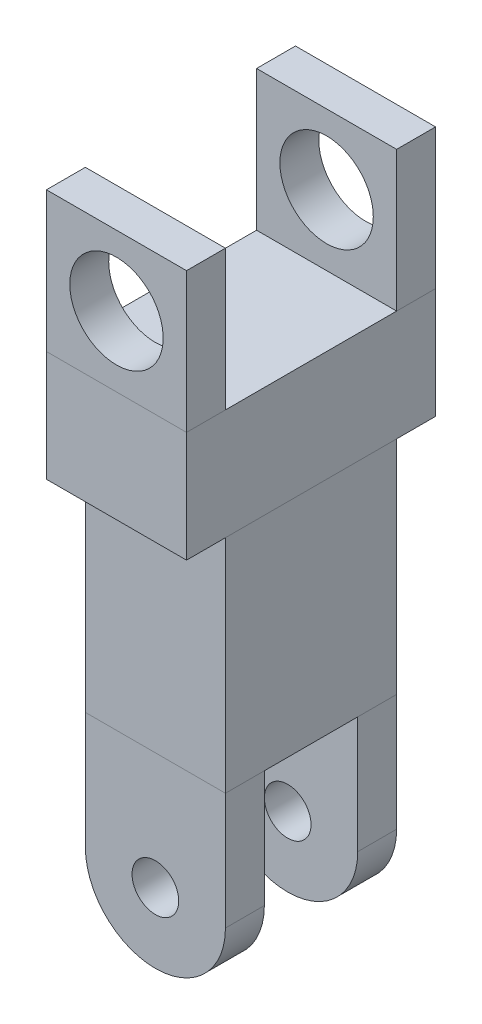
ISO-10303-21;
HEADER;
FILE_DESCRIPTION(('STEP AP214'),'2;1');
FILE_NAME('part.step','',(''),(''),'','','');
FILE_SCHEMA(('AUTOMOTIVE_DESIGN { 1 0 10303 214 1 1 1 1 }'));
ENDSEC;
DATA;
#1=APPLICATION_CONTEXT('core data for automotive mechanical design processes');
#2=APPLICATION_PROTOCOL_DEFINITION('international standard','automotive_design',2000,#1);
#3=PRODUCT_CONTEXT('',#1,'mechanical');
#4=PRODUCT('Part','Part','',(#3));
#5=PRODUCT_RELATED_PRODUCT_CATEGORY('part','',(#4));
#6=PRODUCT_DEFINITION_FORMATION('','',#4);
#7=PRODUCT_DEFINITION_CONTEXT('part definition',#1,'design');
#8=PRODUCT_DEFINITION('design','',#6,#7);
#9=PRODUCT_DEFINITION_SHAPE('','',#8);
#10=(LENGTH_UNIT() NAMED_UNIT(*) SI_UNIT(.MILLI.,.METRE.));
#11=(NAMED_UNIT(*) PLANE_ANGLE_UNIT() SI_UNIT($,.RADIAN.));
#12=(NAMED_UNIT(*) SI_UNIT($,.STERADIAN.) SOLID_ANGLE_UNIT());
#13=UNCERTAINTY_MEASURE_WITH_UNIT(LENGTH_MEASURE(1.E-05),#10,'distance_accuracy_value','');
#14=(GEOMETRIC_REPRESENTATION_CONTEXT(3) GLOBAL_UNCERTAINTY_ASSIGNED_CONTEXT((#13)) GLOBAL_UNIT_ASSIGNED_CONTEXT((#10,
#11,#12)) REPRESENTATION_CONTEXT('',''));
#15=CARTESIAN_POINT('',(0.,0.,0.));
#16=DIRECTION('',(0.,0.,1.));
#17=DIRECTION('',(1.,0.,0.));
#18=AXIS2_PLACEMENT_3D('',#15,#16,#17);
#19=CARTESIAN_POINT('',(4.5,37.83,0.));
#20=DIRECTION('',(-1.,0.,0.));
#21=DIRECTION('',(0.,0.,1.));
#22=AXIS2_PLACEMENT_3D('',#19,#20,#21);
#23=PLANE('',#22);
#24=DIRECTION('',(0.,0.,-1.));
#25=VECTOR('',#24,1.);
#26=CARTESIAN_POINT('',(4.5,28.83,0.));
#27=LINE('',#26,#25);
#28=CARTESIAN_POINT('',(4.5,28.83,2.5));
#29=VERTEX_POINT('',#28);
#30=CARTESIAN_POINT('',(4.5,28.83,0.));
#31=VERTEX_POINT('',#30);
#32=EDGE_CURVE('E115',#29,#31,#27,.T.);
#33=ORIENTED_EDGE('',*,*,#32,.T.);
#34=DIRECTION('',(0.,-1.,0.));
#35=VECTOR('',#34,1.);
#36=CARTESIAN_POINT('',(4.5,37.83,0.));
#37=LINE('',#36,#35);
#38=CARTESIAN_POINT('',(4.5,37.83,0.));
#39=VERTEX_POINT('',#38);
#40=EDGE_CURVE('E12',#39,#31,#37,.T.);
#41=ORIENTED_EDGE('',*,*,#40,.F.);
#42=DIRECTION('',(0.,0.,-1.));
#43=VECTOR('',#42,1.);
#44=CARTESIAN_POINT('',(4.5,37.83,0.));
#45=LINE('',#44,#43);
#46=CARTESIAN_POINT('',(4.5,37.83,2.5));
#47=VERTEX_POINT('',#46);
#48=EDGE_CURVE('E103',#47,#39,#45,.T.);
#49=ORIENTED_EDGE('',*,*,#48,.F.);
#50=DIRECTION('',(0.,-1.,0.));
#51=VECTOR('',#50,1.);
#52=CARTESIAN_POINT('',(4.5,37.83,2.5));
#53=LINE('',#52,#51);
#54=EDGE_CURVE('E111',#47,#29,#53,.T.);
#55=ORIENTED_EDGE('',*,*,#54,.T.);
#56=EDGE_LOOP('',(#33,#41,#49,#55));
#57=FACE_BOUND('',#56,.T.);
#58=ADVANCED_FACE('F52',(#57),#23,.F.);
#59=CARTESIAN_POINT('',(0.,37.83,0.));
#60=DIRECTION('',(0.,0.,1.));
#61=DIRECTION('',(1.,0.,0.));
#62=AXIS2_PLACEMENT_3D('',#59,#60,#61);
#63=PLANE('',#62);
#64=CARTESIAN_POINT('',(0.,33.33,0.));
#65=DIRECTION('',(0.,0.,1.));
#66=DIRECTION('',(1.,0.,0.));
#67=AXIS2_PLACEMENT_3D('',#64,#65,#66);
#68=CIRCLE('',#67,3.);
#69=CARTESIAN_POINT('',(3.,33.33,0.));
#70=VERTEX_POINT('',#69);
#71=EDGE_CURVE('E118',#70,#70,#68,.T.);
#72=ORIENTED_EDGE('',*,*,#71,.T.);
#73=EDGE_LOOP('',(#72));
#74=FACE_BOUND('',#73,.T.);
#75=DIRECTION('',(-1.,0.,0.));
#76=VECTOR('',#75,1.);
#77=CARTESIAN_POINT('',(0.,28.83,0.));
#78=LINE('',#77,#76);
#79=CARTESIAN_POINT('',(-4.5,28.83,0.));
#80=VERTEX_POINT('',#79);
#81=EDGE_CURVE('E107',#31,#80,#78,.T.);
#82=ORIENTED_EDGE('',*,*,#81,.T.);
#83=DIRECTION('',(0.,-1.,0.));
#84=VECTOR('',#83,1.);
#85=CARTESIAN_POINT('',(-4.5,37.83,0.));
#86=LINE('',#85,#84);
#87=CARTESIAN_POINT('',(-4.5,37.83,0.));
#88=VERTEX_POINT('',#87);
#89=EDGE_CURVE('E60',#88,#80,#86,.T.);
#90=ORIENTED_EDGE('',*,*,#89,.F.);
#91=DIRECTION('',(-1.,0.,0.));
#92=VECTOR('',#91,1.);
#93=CARTESIAN_POINT('',(0.,37.83,0.));
#94=LINE('',#93,#92);
#95=EDGE_CURVE('E98',#39,#88,#94,.T.);
#96=ORIENTED_EDGE('',*,*,#95,.F.);
#97=ORIENTED_EDGE('',*,*,#40,.T.);
#98=EDGE_LOOP('',(#82,#90,#96,#97));
#99=FACE_BOUND('',#98,.T.);
#100=ADVANCED_FACE('F106',(#74,#99),#63,.F.);
#101=CARTESIAN_POINT('',(-4.5,37.83,0.));
#102=DIRECTION('',(1.,0.,0.));
#103=DIRECTION('',(0.,0.,-1.));
#104=AXIS2_PLACEMENT_3D('',#101,#102,#103);
#105=PLANE('',#104);
#106=DIRECTION('',(0.,0.,1.));
#107=VECTOR('',#106,1.);
#108=CARTESIAN_POINT('',(-4.5,28.83,0.));
#109=LINE('',#108,#107);
#110=CARTESIAN_POINT('',(-4.5,28.83,2.5));
#111=VERTEX_POINT('',#110);
#112=EDGE_CURVE('E85',#80,#111,#109,.T.);
#113=ORIENTED_EDGE('',*,*,#112,.T.);
#114=DIRECTION('',(0.,-1.,0.));
#115=VECTOR('',#114,1.);
#116=CARTESIAN_POINT('',(-4.5,37.83,2.5));
#117=LINE('',#116,#115);
#118=CARTESIAN_POINT('',(-4.5,37.83,2.5));
#119=VERTEX_POINT('',#118);
#120=EDGE_CURVE('E108',#119,#111,#117,.T.);
#121=ORIENTED_EDGE('',*,*,#120,.F.);
#122=DIRECTION('',(0.,0.,1.));
#123=VECTOR('',#122,1.);
#124=CARTESIAN_POINT('',(-4.5,37.83,0.));
#125=LINE('',#124,#123);
#126=EDGE_CURVE('E101',#88,#119,#125,.T.);
#127=ORIENTED_EDGE('',*,*,#126,.F.);
#128=ORIENTED_EDGE('',*,*,#89,.T.);
#129=EDGE_LOOP('',(#113,#121,#127,#128));
#130=FACE_BOUND('',#129,.T.);
#131=ADVANCED_FACE('F109',(#130),#105,.F.);
#132=CARTESIAN_POINT('',(0.,37.83,2.5));
#133=DIRECTION('',(0.,0.,-1.));
#134=DIRECTION('',(-1.,0.,0.));
#135=AXIS2_PLACEMENT_3D('',#132,#133,#134);
#136=PLANE('',#135);
#137=CARTESIAN_POINT('',(0.,33.33,2.5));
#138=DIRECTION('',(0.,0.,-1.));
#139=DIRECTION('',(-1.,0.,0.));
#140=AXIS2_PLACEMENT_3D('',#137,#138,#139);
#141=CIRCLE('',#140,3.);
#142=CARTESIAN_POINT('',(-3.,33.33,2.5));
#143=VERTEX_POINT('',#142);
#144=EDGE_CURVE('E131',#143,#143,#141,.T.);
#145=ORIENTED_EDGE('',*,*,#144,.T.);
#146=EDGE_LOOP('',(#145));
#147=FACE_BOUND('',#146,.T.);
#148=DIRECTION('',(1.,0.,0.));
#149=VECTOR('',#148,1.);
#150=CARTESIAN_POINT('',(0.,28.83,2.5));
#151=LINE('',#150,#149);
#152=EDGE_CURVE('E91',#111,#29,#151,.T.);
#153=ORIENTED_EDGE('',*,*,#152,.T.);
#154=ORIENTED_EDGE('',*,*,#54,.F.);
#155=DIRECTION('',(1.,0.,0.));
#156=VECTOR('',#155,1.);
#157=CARTESIAN_POINT('',(0.,37.83,2.5));
#158=LINE('',#157,#156);
#159=EDGE_CURVE('E68',#119,#47,#158,.T.);
#160=ORIENTED_EDGE('',*,*,#159,.F.);
#161=ORIENTED_EDGE('',*,*,#120,.T.);
#162=EDGE_LOOP('',(#153,#154,#160,#161));
#163=FACE_BOUND('',#162,.T.);
#164=ADVANCED_FACE('F123',(#147,#163),#136,.F.);
#165=CARTESIAN_POINT('',(0.,37.83,0.));
#166=DIRECTION('',(0.,1.,0.));
#167=DIRECTION('',(0.,0.,1.));
#168=AXIS2_PLACEMENT_3D('',#165,#166,#167);
#169=PLANE('',#168);
#170=ORIENTED_EDGE('',*,*,#48,.T.);
#171=ORIENTED_EDGE('',*,*,#95,.T.);
#172=ORIENTED_EDGE('',*,*,#126,.T.);
#173=ORIENTED_EDGE('',*,*,#159,.T.);
#174=EDGE_LOOP('',(#170,#171,#172,#173));
#175=FACE_BOUND('',#174,.T.);
#176=ADVANCED_FACE('F99',(#175),#169,.T.);
#177=CARTESIAN_POINT('',(0.,28.83,0.));
#178=DIRECTION('',(0.,1.,0.));
#179=DIRECTION('',(0.,0.,1.));
#180=AXIS2_PLACEMENT_3D('',#177,#178,#179);
#181=PLANE('',#180);
#182=ORIENTED_EDGE('',*,*,#32,.F.);
#183=ORIENTED_EDGE('',*,*,#152,.F.);
#184=ORIENTED_EDGE('',*,*,#112,.F.);
#185=ORIENTED_EDGE('',*,*,#81,.F.);
#186=EDGE_LOOP('',(#182,#183,#184,#185));
#187=FACE_BOUND('',#186,.T.);
#188=ADVANCED_FACE('F126',(#187),#181,.F.);
#189=CARTESIAN_POINT('',(0.,33.33,2.5));
#190=DIRECTION('',(0.,0.,-1.));
#191=DIRECTION('',(-1.,0.,0.));
#192=AXIS2_PLACEMENT_3D('',#189,#190,#191);
#193=CYLINDRICAL_SURFACE('',#192,3.);
#194=ORIENTED_EDGE('',*,*,#144,.F.);
#195=EDGE_LOOP('',(#194));
#196=FACE_BOUND('',#195,.T.);
#197=ORIENTED_EDGE('',*,*,#71,.F.);
#198=EDGE_LOOP('',(#197));
#199=FACE_BOUND('',#198,.T.);
#200=ADVANCED_FACE('F136',(#196,#199),#193,.F.);
#201=CLOSED_SHELL('',(#58,#100,#131,#164,#176,#188,#200));
#202=MANIFOLD_SOLID_BREP('B2',#201);
#203=CARTESIAN_POINT('',(0.,37.83,-11.));
#204=DIRECTION('',(0.,0.,1.));
#205=DIRECTION('',(1.,0.,0.));
#206=AXIS2_PLACEMENT_3D('',#203,#204,#205);
#207=PLANE('',#206);
#208=CARTESIAN_POINT('',(0.,33.33,-11.));
#209=DIRECTION('',(0.,0.,1.));
#210=DIRECTION('',(1.,0.,0.));
#211=AXIS2_PLACEMENT_3D('',#208,#209,#210);
#212=CIRCLE('',#211,3.);
#213=CARTESIAN_POINT('',(3.,33.33,-11.));
#214=VERTEX_POINT('',#213);
#215=EDGE_CURVE('E284',#214,#214,#212,.T.);
#216=ORIENTED_EDGE('',*,*,#215,.F.);
#217=EDGE_LOOP('',(#216));
#218=FACE_BOUND('',#217,.T.);
#219=DIRECTION('',(-1.,0.,0.));
#220=VECTOR('',#219,1.);
#221=CARTESIAN_POINT('',(0.,28.83,-11.));
#222=LINE('',#221,#220);
#223=CARTESIAN_POINT('',(4.5,28.83,-11.));
#224=VERTEX_POINT('',#223);
#225=CARTESIAN_POINT('',(-4.5,28.83,-11.));
#226=VERTEX_POINT('',#225);
#227=EDGE_CURVE('E281',#224,#226,#222,.T.);
#228=ORIENTED_EDGE('',*,*,#227,.F.);
#229=DIRECTION('',(0.,-1.,0.));
#230=VECTOR('',#229,1.);
#231=CARTESIAN_POINT('',(4.5,37.83,-11.));
#232=LINE('',#231,#230);
#233=CARTESIAN_POINT('',(4.5,37.83,-11.));
#234=VERTEX_POINT('',#233);
#235=EDGE_CURVE('E50',#234,#224,#232,.T.);
#236=ORIENTED_EDGE('',*,*,#235,.F.);
#237=DIRECTION('',(-1.,0.,0.));
#238=VECTOR('',#237,1.);
#239=CARTESIAN_POINT('',(0.,37.83,-11.));
#240=LINE('',#239,#238);
#241=CARTESIAN_POINT('',(-4.5,37.83,-11.));
#242=VERTEX_POINT('',#241);
#243=EDGE_CURVE('E269',#234,#242,#240,.T.);
#244=ORIENTED_EDGE('',*,*,#243,.T.);
#245=DIRECTION('',(0.,-1.,0.));
#246=VECTOR('',#245,1.);
#247=CARTESIAN_POINT('',(-4.5,37.83,-11.));
#248=LINE('',#247,#246);
#249=EDGE_CURVE('E258',#242,#226,#248,.T.);
#250=ORIENTED_EDGE('',*,*,#249,.T.);
#251=EDGE_LOOP('',(#228,#236,#244,#250));
#252=FACE_BOUND('',#251,.T.);
#253=ADVANCED_FACE('F219',(#218,#252),#207,.T.);
#254=CARTESIAN_POINT('',(4.5,37.83,0.));
#255=DIRECTION('',(-1.,0.,0.));
#256=DIRECTION('',(0.,0.,1.));
#257=AXIS2_PLACEMENT_3D('',#254,#255,#256);
#258=PLANE('',#257);
#259=DIRECTION('',(0.,0.,-1.));
#260=VECTOR('',#259,1.);
#261=CARTESIAN_POINT('',(4.5,28.83,0.));
#262=LINE('',#261,#260);
#263=CARTESIAN_POINT('',(4.5,28.83,-13.5));
#264=VERTEX_POINT('',#263);
#265=EDGE_CURVE('E274',#224,#264,#262,.T.);
#266=ORIENTED_EDGE('',*,*,#265,.T.);
#267=DIRECTION('',(0.,-1.,0.));
#268=VECTOR('',#267,1.);
#269=CARTESIAN_POINT('',(4.5,37.83,-13.5));
#270=LINE('',#269,#268);
#271=CARTESIAN_POINT('',(4.5,37.83,-13.5));
#272=VERTEX_POINT('',#271);
#273=EDGE_CURVE('E227',#272,#264,#270,.T.);
#274=ORIENTED_EDGE('',*,*,#273,.F.);
#275=DIRECTION('',(0.,0.,-1.));
#276=VECTOR('',#275,1.);
#277=CARTESIAN_POINT('',(4.5,37.83,0.));
#278=LINE('',#277,#276);
#279=EDGE_CURVE('E264',#234,#272,#278,.T.);
#280=ORIENTED_EDGE('',*,*,#279,.F.);
#281=ORIENTED_EDGE('',*,*,#235,.T.);
#282=EDGE_LOOP('',(#266,#274,#280,#281));
#283=FACE_BOUND('',#282,.T.);
#284=ADVANCED_FACE('F272',(#283),#258,.F.);
#285=CARTESIAN_POINT('',(0.,37.83,-13.5));
#286=DIRECTION('',(0.,0.,1.));
#287=DIRECTION('',(1.,0.,0.));
#288=AXIS2_PLACEMENT_3D('',#285,#286,#287);
#289=PLANE('',#288);
#290=CARTESIAN_POINT('',(0.,33.33,-13.5));
#291=DIRECTION('',(0.,0.,-1.));
#292=DIRECTION('',(-1.,0.,0.));
#293=AXIS2_PLACEMENT_3D('',#290,#291,#292);
#294=CIRCLE('',#293,3.);
#295=CARTESIAN_POINT('',(-3.,33.33,-13.5));
#296=VERTEX_POINT('',#295);
#297=EDGE_CURVE('E303',#296,#296,#294,.T.);
#298=ORIENTED_EDGE('',*,*,#297,.F.);
#299=EDGE_LOOP('',(#298));
#300=FACE_BOUND('',#299,.T.);
#301=DIRECTION('',(-1.,0.,0.));
#302=VECTOR('',#301,1.);
#303=CARTESIAN_POINT('',(0.,28.83,-13.5));
#304=LINE('',#303,#302);
#305=CARTESIAN_POINT('',(-4.5,28.83,-13.5));
#306=VERTEX_POINT('',#305);
#307=EDGE_CURVE('E251',#264,#306,#304,.T.);
#308=ORIENTED_EDGE('',*,*,#307,.T.);
#309=DIRECTION('',(0.,-1.,0.));
#310=VECTOR('',#309,1.);
#311=CARTESIAN_POINT('',(-4.5,37.83,-13.5));
#312=LINE('',#311,#310);
#313=CARTESIAN_POINT('',(-4.5,37.83,-13.5));
#314=VERTEX_POINT('',#313);
#315=EDGE_CURVE('E275',#314,#306,#312,.T.);
#316=ORIENTED_EDGE('',*,*,#315,.F.);
#317=DIRECTION('',(-1.,0.,0.));
#318=VECTOR('',#317,1.);
#319=CARTESIAN_POINT('',(0.,37.83,-13.5));
#320=LINE('',#319,#318);
#321=EDGE_CURVE('E268',#272,#314,#320,.T.);
#322=ORIENTED_EDGE('',*,*,#321,.F.);
#323=ORIENTED_EDGE('',*,*,#273,.T.);
#324=EDGE_LOOP('',(#308,#316,#322,#323));
#325=FACE_BOUND('',#324,.T.);
#326=ADVANCED_FACE('F276',(#300,#325),#289,.F.);
#327=CARTESIAN_POINT('',(-4.5,37.83,0.));
#328=DIRECTION('',(1.,0.,0.));
#329=DIRECTION('',(0.,0.,-1.));
#330=AXIS2_PLACEMENT_3D('',#327,#328,#329);
#331=PLANE('',#330);
#332=DIRECTION('',(0.,0.,1.));
#333=VECTOR('',#332,1.);
#334=CARTESIAN_POINT('',(-4.5,28.83,0.));
#335=LINE('',#334,#333);
#336=EDGE_CURVE('E287',#306,#226,#335,.T.);
#337=ORIENTED_EDGE('',*,*,#336,.T.);
#338=ORIENTED_EDGE('',*,*,#249,.F.);
#339=DIRECTION('',(0.,0.,1.));
#340=VECTOR('',#339,1.);
#341=CARTESIAN_POINT('',(-4.5,37.83,0.));
#342=LINE('',#341,#340);
#343=EDGE_CURVE('E235',#314,#242,#342,.T.);
#344=ORIENTED_EDGE('',*,*,#343,.F.);
#345=ORIENTED_EDGE('',*,*,#315,.T.);
#346=EDGE_LOOP('',(#337,#338,#344,#345));
#347=FACE_BOUND('',#346,.T.);
#348=ADVANCED_FACE('F292',(#347),#331,.F.);
#349=CARTESIAN_POINT('',(0.,37.83,0.));
#350=DIRECTION('',(0.,1.,0.));
#351=DIRECTION('',(0.,0.,1.));
#352=AXIS2_PLACEMENT_3D('',#349,#350,#351);
#353=PLANE('',#352);
#354=ORIENTED_EDGE('',*,*,#243,.F.);
#355=ORIENTED_EDGE('',*,*,#279,.T.);
#356=ORIENTED_EDGE('',*,*,#321,.T.);
#357=ORIENTED_EDGE('',*,*,#343,.T.);
#358=EDGE_LOOP('',(#354,#355,#356,#357));
#359=FACE_BOUND('',#358,.T.);
#360=ADVANCED_FACE('F266',(#359),#353,.T.);
#361=CARTESIAN_POINT('',(0.,28.83,0.));
#362=DIRECTION('',(0.,1.,0.));
#363=DIRECTION('',(0.,0.,1.));
#364=AXIS2_PLACEMENT_3D('',#361,#362,#363);
#365=PLANE('',#364);
#366=ORIENTED_EDGE('',*,*,#227,.T.);
#367=ORIENTED_EDGE('',*,*,#336,.F.);
#368=ORIENTED_EDGE('',*,*,#307,.F.);
#369=ORIENTED_EDGE('',*,*,#265,.F.);
#370=EDGE_LOOP('',(#366,#367,#368,#369));
#371=FACE_BOUND('',#370,.T.);
#372=ADVANCED_FACE('F294',(#371),#365,.F.);
#373=CARTESIAN_POINT('',(0.,33.33,2.5));
#374=DIRECTION('',(0.,0.,-1.));
#375=DIRECTION('',(-1.,0.,0.));
#376=AXIS2_PLACEMENT_3D('',#373,#374,#375);
#377=CYLINDRICAL_SURFACE('',#376,3.);
#378=ORIENTED_EDGE('',*,*,#215,.T.);
#379=EDGE_LOOP('',(#378));
#380=FACE_BOUND('',#379,.T.);
#381=ORIENTED_EDGE('',*,*,#297,.T.);
#382=EDGE_LOOP('',(#381));
#383=FACE_BOUND('',#382,.T.);
#384=ADVANCED_FACE('F309',(#380,#383),#377,.F.);
#385=CLOSED_SHELL('',(#253,#284,#326,#348,#360,#372,#384));
#386=MANIFOLD_SOLID_BREP('B6',#385);
#387=CARTESIAN_POINT('',(4.5,28.83,0.));
#388=DIRECTION('',(1.,0.,0.));
#389=DIRECTION('',(0.,0.,-1.));
#390=AXIS2_PLACEMENT_3D('',#387,#388,#389);
#391=PLANE('',#390);
#392=DIRECTION('',(0.,0.,1.));
#393=VECTOR('',#392,1.);
#394=CARTESIAN_POINT('',(4.5,21.72,0.));
#395=LINE('',#394,#393);
#396=CARTESIAN_POINT('',(4.5,21.72,-13.5));
#397=VERTEX_POINT('',#396);
#398=CARTESIAN_POINT('',(4.5,21.72,2.5));
#399=VERTEX_POINT('',#398);
#400=EDGE_CURVE('E449',#397,#399,#395,.T.);
#401=ORIENTED_EDGE('',*,*,#400,.F.);
#402=DIRECTION('',(0.,-1.,0.));
#403=VECTOR('',#402,1.);
#404=CARTESIAN_POINT('',(4.5,28.83,-13.5));
#405=LINE('',#404,#403);
#406=CARTESIAN_POINT('',(4.5,28.83,-13.5));
#407=VERTEX_POINT('',#406);
#408=EDGE_CURVE('E217',#407,#397,#405,.T.);
#409=ORIENTED_EDGE('',*,*,#408,.F.);
#410=DIRECTION('',(0.,0.,1.));
#411=VECTOR('',#410,1.);
#412=CARTESIAN_POINT('',(4.5,28.83,0.));
#413=LINE('',#412,#411);
#414=CARTESIAN_POINT('',(4.5,28.83,2.5));
#415=VERTEX_POINT('',#414);
#416=EDGE_CURVE('E442',#407,#415,#413,.T.);
#417=ORIENTED_EDGE('',*,*,#416,.T.);
#418=DIRECTION('',(0.,-1.,0.));
#419=VECTOR('',#418,1.);
#420=CARTESIAN_POINT('',(4.5,28.83,2.5));
#421=LINE('',#420,#419);
#422=EDGE_CURVE('E424',#415,#399,#421,.T.);
#423=ORIENTED_EDGE('',*,*,#422,.T.);
#424=EDGE_LOOP('',(#401,#409,#417,#423));
#425=FACE_BOUND('',#424,.T.);
#426=ADVANCED_FACE('F386',(#425),#391,.T.);
#427=CARTESIAN_POINT('',(0.,28.83,-13.5));
#428=DIRECTION('',(0.,0.,-1.));
#429=DIRECTION('',(-1.,0.,0.));
#430=AXIS2_PLACEMENT_3D('',#427,#428,#429);
#431=PLANE('',#430);
#432=DIRECTION('',(1.,0.,0.));
#433=VECTOR('',#432,1.);
#434=CARTESIAN_POINT('',(0.,21.72,-13.5));
#435=LINE('',#434,#433);
#436=CARTESIAN_POINT('',(-4.5,21.72,-13.5));
#437=VERTEX_POINT('',#436);
#438=EDGE_CURVE('E435',#437,#397,#435,.T.);
#439=ORIENTED_EDGE('',*,*,#438,.F.);
#440=DIRECTION('',(0.,-1.,0.));
#441=VECTOR('',#440,1.);
#442=CARTESIAN_POINT('',(-4.5,28.83,-13.5));
#443=LINE('',#442,#441);
#444=CARTESIAN_POINT('',(-4.5,28.83,-13.5));
#445=VERTEX_POINT('',#444);
#446=EDGE_CURVE('E394',#445,#437,#443,.T.);
#447=ORIENTED_EDGE('',*,*,#446,.F.);
#448=DIRECTION('',(1.,0.,0.));
#449=VECTOR('',#448,1.);
#450=CARTESIAN_POINT('',(0.,28.83,-13.5));
#451=LINE('',#450,#449);
#452=EDGE_CURVE('E433',#445,#407,#451,.T.);
#453=ORIENTED_EDGE('',*,*,#452,.T.);
#454=ORIENTED_EDGE('',*,*,#408,.T.);
#455=EDGE_LOOP('',(#439,#447,#453,#454));
#456=FACE_BOUND('',#455,.T.);
#457=ADVANCED_FACE('F432',(#456),#431,.T.);
#458=CARTESIAN_POINT('',(-4.5,28.83,0.));
#459=DIRECTION('',(-1.,0.,0.));
#460=DIRECTION('',(0.,0.,1.));
#461=AXIS2_PLACEMENT_3D('',#458,#459,#460);
#462=PLANE('',#461);
#463=DIRECTION('',(0.,0.,-1.));
#464=VECTOR('',#463,1.);
#465=CARTESIAN_POINT('',(-4.5,21.72,0.));
#466=LINE('',#465,#464);
#467=CARTESIAN_POINT('',(-4.5,21.72,2.5));
#468=VERTEX_POINT('',#467);
#469=EDGE_CURVE('E453',#468,#437,#466,.T.);
#470=ORIENTED_EDGE('',*,*,#469,.F.);
#471=DIRECTION('',(0.,-1.,0.));
#472=VECTOR('',#471,1.);
#473=CARTESIAN_POINT('',(-4.5,28.83,2.5));
#474=LINE('',#473,#472);
#475=CARTESIAN_POINT('',(-4.5,28.83,2.5));
#476=VERTEX_POINT('',#475);
#477=EDGE_CURVE('E417',#476,#468,#474,.T.);
#478=ORIENTED_EDGE('',*,*,#477,.F.);
#479=DIRECTION('',(0.,0.,-1.));
#480=VECTOR('',#479,1.);
#481=CARTESIAN_POINT('',(-4.5,28.83,0.));
#482=LINE('',#481,#480);
#483=EDGE_CURVE('E441',#476,#445,#482,.T.);
#484=ORIENTED_EDGE('',*,*,#483,.T.);
#485=ORIENTED_EDGE('',*,*,#446,.T.);
#486=EDGE_LOOP('',(#470,#478,#484,#485));
#487=FACE_BOUND('',#486,.T.);
#488=ADVANCED_FACE('F444',(#487),#462,.T.);
#489=CARTESIAN_POINT('',(0.,28.83,2.5));
#490=DIRECTION('',(0.,0.,-1.));
#491=DIRECTION('',(-1.,0.,0.));
#492=AXIS2_PLACEMENT_3D('',#489,#490,#491);
#493=PLANE('',#492);
#494=DIRECTION('',(1.,0.,0.));
#495=VECTOR('',#494,1.);
#496=CARTESIAN_POINT('',(0.,21.72,2.5));
#497=LINE('',#496,#495);
#498=EDGE_CURVE('E455',#468,#399,#497,.T.);
#499=ORIENTED_EDGE('',*,*,#498,.T.);
#500=ORIENTED_EDGE('',*,*,#422,.F.);
#501=DIRECTION('',(1.,0.,0.));
#502=VECTOR('',#501,1.);
#503=CARTESIAN_POINT('',(0.,28.83,2.5));
#504=LINE('',#503,#502);
#505=EDGE_CURVE('E402',#476,#415,#504,.T.);
#506=ORIENTED_EDGE('',*,*,#505,.F.);
#507=ORIENTED_EDGE('',*,*,#477,.T.);
#508=EDGE_LOOP('',(#499,#500,#506,#507));
#509=FACE_BOUND('',#508,.T.);
#510=ADVANCED_FACE('F465',(#509),#493,.F.);
#511=CARTESIAN_POINT('',(0.,28.83,0.));
#512=DIRECTION('',(0.,1.,0.));
#513=DIRECTION('',(0.,0.,1.));
#514=AXIS2_PLACEMENT_3D('',#511,#512,#513);
#515=PLANE('',#514);
#516=ORIENTED_EDGE('',*,*,#416,.F.);
#517=ORIENTED_EDGE('',*,*,#452,.F.);
#518=ORIENTED_EDGE('',*,*,#483,.F.);
#519=ORIENTED_EDGE('',*,*,#505,.T.);
#520=EDGE_LOOP('',(#516,#517,#518,#519));
#521=FACE_BOUND('',#520,.T.);
#522=ADVANCED_FACE('F440',(#521),#515,.T.);
#523=CARTESIAN_POINT('',(0.,21.72,0.));
#524=DIRECTION('',(0.,1.,0.));
#525=DIRECTION('',(0.,0.,1.));
#526=AXIS2_PLACEMENT_3D('',#523,#524,#525);
#527=PLANE('',#526);
#528=ORIENTED_EDGE('',*,*,#400,.T.);
#529=ORIENTED_EDGE('',*,*,#498,.F.);
#530=ORIENTED_EDGE('',*,*,#469,.T.);
#531=ORIENTED_EDGE('',*,*,#438,.T.);
#532=EDGE_LOOP('',(#528,#529,#530,#531));
#533=FACE_BOUND('',#532,.T.);
#534=ADVANCED_FACE('F470',(#533),#527,.F.);
#535=CLOSED_SHELL('',(#426,#457,#488,#510,#522,#534));
#536=MANIFOLD_SOLID_BREP('B44',#535);
#537=CARTESIAN_POINT('',(4.5,21.72,0.));
#538=DIRECTION('',(1.,0.,0.));
#539=DIRECTION('',(0.,0.,-1.));
#540=AXIS2_PLACEMENT_3D('',#537,#538,#539);
#541=PLANE('',#540);
#542=DIRECTION('',(0.,0.,1.));
#543=VECTOR('',#542,1.);
#544=CARTESIAN_POINT('',(4.5,7.5,0.));
#545=LINE('',#544,#543);
#546=CARTESIAN_POINT('',(4.5,7.5,-11.));
#547=VERTEX_POINT('',#546);
#548=CARTESIAN_POINT('',(4.5,7.5,0.));
#549=VERTEX_POINT('',#548);
#550=EDGE_CURVE('E612',#547,#549,#545,.T.);
#551=ORIENTED_EDGE('',*,*,#550,.F.);
#552=DIRECTION('',(0.,-1.,0.));
#553=VECTOR('',#552,1.);
#554=CARTESIAN_POINT('',(4.5,21.72,-11.));
#555=LINE('',#554,#553);
#556=CARTESIAN_POINT('',(4.5,21.72,-11.));
#557=VERTEX_POINT('',#556);
#558=EDGE_CURVE('E384',#557,#547,#555,.T.);
#559=ORIENTED_EDGE('',*,*,#558,.F.);
#560=DIRECTION('',(0.,0.,1.));
#561=VECTOR('',#560,1.);
#562=CARTESIAN_POINT('',(4.5,21.72,0.));
#563=LINE('',#562,#561);
#564=CARTESIAN_POINT('',(4.5,21.72,0.));
#565=VERTEX_POINT('',#564);
#566=EDGE_CURVE('E593',#557,#565,#563,.T.);
#567=ORIENTED_EDGE('',*,*,#566,.T.);
#568=DIRECTION('',(0.,-1.,0.));
#569=VECTOR('',#568,1.);
#570=CARTESIAN_POINT('',(4.5,21.72,0.));
#571=LINE('',#570,#569);
#572=EDGE_CURVE('E561',#565,#549,#571,.T.);
#573=ORIENTED_EDGE('',*,*,#572,.T.);
#574=EDGE_LOOP('',(#551,#559,#567,#573));
#575=FACE_BOUND('',#574,.T.);
#576=ADVANCED_FACE('F544',(#575),#541,.T.);
#577=CARTESIAN_POINT('',(0.,21.72,-11.));
#578=DIRECTION('',(0.,0.,1.));
#579=DIRECTION('',(1.,0.,0.));
#580=AXIS2_PLACEMENT_3D('',#577,#578,#579);
#581=PLANE('',#580);
#582=DIRECTION('',(-1.,0.,0.));
#583=VECTOR('',#582,1.);
#584=CARTESIAN_POINT('',(0.,7.5,-11.));
#585=LINE('',#584,#583);
#586=CARTESIAN_POINT('',(-4.5,7.5,-11.));
#587=VERTEX_POINT('',#586);
#588=EDGE_CURVE('E600',#547,#587,#585,.T.);
#589=ORIENTED_EDGE('',*,*,#588,.T.);
#590=DIRECTION('',(0.,-1.,0.));
#591=VECTOR('',#590,1.);
#592=CARTESIAN_POINT('',(-4.5,21.72,-11.));
#593=LINE('',#592,#591);
#594=CARTESIAN_POINT('',(-4.5,21.72,-11.));
#595=VERTEX_POINT('',#594);
#596=EDGE_CURVE('E553',#595,#587,#593,.T.);
#597=ORIENTED_EDGE('',*,*,#596,.F.);
#598=DIRECTION('',(-1.,0.,0.));
#599=VECTOR('',#598,1.);
#600=CARTESIAN_POINT('',(0.,21.72,-11.));
#601=LINE('',#600,#599);
#602=EDGE_CURVE('E587',#557,#595,#601,.T.);
#603=ORIENTED_EDGE('',*,*,#602,.F.);
#604=ORIENTED_EDGE('',*,*,#558,.T.);
#605=EDGE_LOOP('',(#589,#597,#603,#604));
#606=FACE_BOUND('',#605,.T.);
#607=ADVANCED_FACE('F598',(#606),#581,.F.);
#608=CARTESIAN_POINT('',(-4.5,21.72,0.));
#609=DIRECTION('',(1.,0.,0.));
#610=DIRECTION('',(0.,0.,-1.));
#611=AXIS2_PLACEMENT_3D('',#608,#609,#610);
#612=PLANE('',#611);
#613=DIRECTION('',(0.,0.,1.));
#614=VECTOR('',#613,1.);
#615=CARTESIAN_POINT('',(-4.5,7.5,0.));
#616=LINE('',#615,#614);
#617=CARTESIAN_POINT('',(-4.5,7.5,0.));
#618=VERTEX_POINT('',#617);
#619=EDGE_CURVE('E617',#587,#618,#616,.T.);
#620=ORIENTED_EDGE('',*,*,#619,.T.);
#621=DIRECTION('',(0.,-1.,0.));
#622=VECTOR('',#621,1.);
#623=CARTESIAN_POINT('',(-4.5,21.72,0.));
#624=LINE('',#623,#622);
#625=CARTESIAN_POINT('',(-4.5,21.72,0.));
#626=VERTEX_POINT('',#625);
#627=EDGE_CURVE('E575',#626,#618,#624,.T.);
#628=ORIENTED_EDGE('',*,*,#627,.F.);
#629=DIRECTION('',(0.,0.,1.));
#630=VECTOR('',#629,1.);
#631=CARTESIAN_POINT('',(-4.5,21.72,0.));
#632=LINE('',#631,#630);
#633=EDGE_CURVE('E592',#595,#626,#632,.T.);
#634=ORIENTED_EDGE('',*,*,#633,.F.);
#635=ORIENTED_EDGE('',*,*,#596,.T.);
#636=EDGE_LOOP('',(#620,#628,#634,#635));
#637=FACE_BOUND('',#636,.T.);
#638=ADVANCED_FACE('F604',(#637),#612,.F.);
#639=CARTESIAN_POINT('',(0.,21.72,0.));
#640=DIRECTION('',(0.,0.,1.));
#641=DIRECTION('',(1.,0.,0.));
#642=AXIS2_PLACEMENT_3D('',#639,#640,#641);
#643=PLANE('',#642);
#644=DIRECTION('',(-1.,0.,0.));
#645=VECTOR('',#644,1.);
#646=CARTESIAN_POINT('',(0.,7.5,0.));
#647=LINE('',#646,#645);
#648=EDGE_CURVE('E620',#549,#618,#647,.T.);
#649=ORIENTED_EDGE('',*,*,#648,.F.);
#650=ORIENTED_EDGE('',*,*,#572,.F.);
#651=DIRECTION('',(-1.,0.,0.));
#652=VECTOR('',#651,1.);
#653=CARTESIAN_POINT('',(0.,21.72,0.));
#654=LINE('',#653,#652);
#655=EDGE_CURVE('E606',#565,#626,#654,.T.);
#656=ORIENTED_EDGE('',*,*,#655,.T.);
#657=ORIENTED_EDGE('',*,*,#627,.T.);
#658=EDGE_LOOP('',(#649,#650,#656,#657));
#659=FACE_BOUND('',#658,.T.);
#660=ADVANCED_FACE('F629',(#659),#643,.T.);
#661=CARTESIAN_POINT('',(0.,21.72,0.));
#662=DIRECTION('',(0.,1.,0.));
#663=DIRECTION('',(0.,0.,1.));
#664=AXIS2_PLACEMENT_3D('',#661,#662,#663);
#665=PLANE('',#664);
#666=ORIENTED_EDGE('',*,*,#566,.F.);
#667=ORIENTED_EDGE('',*,*,#602,.T.);
#668=ORIENTED_EDGE('',*,*,#633,.T.);
#669=ORIENTED_EDGE('',*,*,#655,.F.);
#670=EDGE_LOOP('',(#666,#667,#668,#669));
#671=FACE_BOUND('',#670,.T.);
#672=ADVANCED_FACE('F589',(#671),#665,.T.);
#673=CARTESIAN_POINT('',(0.,7.5,0.));
#674=DIRECTION('',(0.,1.,0.));
#675=DIRECTION('',(0.,0.,1.));
#676=AXIS2_PLACEMENT_3D('',#673,#674,#675);
#677=PLANE('',#676);
#678=ORIENTED_EDGE('',*,*,#550,.T.);
#679=ORIENTED_EDGE('',*,*,#648,.T.);
#680=ORIENTED_EDGE('',*,*,#619,.F.);
#681=ORIENTED_EDGE('',*,*,#588,.F.);
#682=EDGE_LOOP('',(#678,#679,#680,#681));
#683=FACE_BOUND('',#682,.T.);
#684=ADVANCED_FACE('F636',(#683),#677,.F.);
#685=CLOSED_SHELL('',(#576,#607,#638,#660,#672,#684));
#686=MANIFOLD_SOLID_BREP('B211',#685);
#687=CARTESIAN_POINT('',(0.,0.,-8.5));
#688=DIRECTION('',(0.,0.,-1.));
#689=DIRECTION('',(-1.,0.,0.));
#690=AXIS2_PLACEMENT_3D('',#687,#688,#689);
#691=CYLINDRICAL_SURFACE('',#690,4.5);
#692=CARTESIAN_POINT('',(0.,0.,-11.));
#693=DIRECTION('',(0.,0.,-1.));
#694=DIRECTION('',(-1.,0.,0.));
#695=AXIS2_PLACEMENT_3D('',#692,#693,#694);
#696=CIRCLE('',#695,4.5);
#697=CARTESIAN_POINT('',(4.5,0.,-11.));
#698=VERTEX_POINT('',#697);
#699=CARTESIAN_POINT('',(-4.5,0.,-11.));
#700=VERTEX_POINT('',#699);
#701=EDGE_CURVE('E775',#698,#700,#696,.T.);
#702=ORIENTED_EDGE('',*,*,#701,.F.);
#703=DIRECTION('',(0.,0.,-1.));
#704=VECTOR('',#703,1.);
#705=CARTESIAN_POINT('',(4.5,0.,-8.5));
#706=LINE('',#705,#704);
#707=CARTESIAN_POINT('',(4.5,0.,-8.5));
#708=VERTEX_POINT('',#707);
#709=EDGE_CURVE('E542',#708,#698,#706,.T.);
#710=ORIENTED_EDGE('',*,*,#709,.F.);
#711=CARTESIAN_POINT('',(0.,0.,-8.5));
#712=DIRECTION('',(0.,0.,-1.));
#713=DIRECTION('',(-1.,0.,0.));
#714=AXIS2_PLACEMENT_3D('',#711,#712,#713);
#715=CIRCLE('',#714,4.5);
#716=CARTESIAN_POINT('',(-4.5,0.,-8.5));
#717=VERTEX_POINT('',#716);
#718=EDGE_CURVE('E765',#708,#717,#715,.T.);
#719=ORIENTED_EDGE('',*,*,#718,.T.);
#720=DIRECTION('',(0.,0.,-1.));
#721=VECTOR('',#720,1.);
#722=CARTESIAN_POINT('',(-4.5,0.,-8.5));
#723=LINE('',#722,#721);
#724=EDGE_CURVE('E708',#717,#700,#723,.T.);
#725=ORIENTED_EDGE('',*,*,#724,.T.);
#726=EDGE_LOOP('',(#702,#710,#719,#725));
#727=FACE_BOUND('',#726,.T.);
#728=ADVANCED_FACE('F704',(#727),#691,.T.);
#729=CARTESIAN_POINT('',(4.5,0.,-8.5));
#730=DIRECTION('',(-1.,0.,0.));
#731=DIRECTION('',(0.,0.,1.));
#732=AXIS2_PLACEMENT_3D('',#729,#730,#731);
#733=PLANE('',#732);
#734=DIRECTION('',(0.,1.,0.));
#735=VECTOR('',#734,1.);
#736=CARTESIAN_POINT('',(4.5,0.,-11.));
#737=LINE('',#736,#735);
#738=CARTESIAN_POINT('',(4.5,7.5,-11.));
#739=VERTEX_POINT('',#738);
#740=EDGE_CURVE('E781',#698,#739,#737,.T.);
#741=ORIENTED_EDGE('',*,*,#740,.T.);
#742=DIRECTION('',(0.,0.,-1.));
#743=VECTOR('',#742,1.);
#744=CARTESIAN_POINT('',(4.5,7.5,-8.5));
#745=LINE('',#744,#743);
#746=CARTESIAN_POINT('',(4.5,7.5,-8.5));
#747=VERTEX_POINT('',#746);
#748=EDGE_CURVE('E714',#747,#739,#745,.T.);
#749=ORIENTED_EDGE('',*,*,#748,.F.);
#750=DIRECTION('',(0.,1.,0.));
#751=VECTOR('',#750,1.);
#752=CARTESIAN_POINT('',(4.5,0.,-8.5));
#753=LINE('',#752,#751);
#754=EDGE_CURVE('E758',#708,#747,#753,.T.);
#755=ORIENTED_EDGE('',*,*,#754,.F.);
#756=ORIENTED_EDGE('',*,*,#709,.T.);
#757=EDGE_LOOP('',(#741,#749,#755,#756));
#758=FACE_BOUND('',#757,.T.);
#759=ADVANCED_FACE('F783',(#758),#733,.F.);
#760=CARTESIAN_POINT('',(0.,7.5,-8.5));
#761=DIRECTION('',(0.,-1.,0.));
#762=DIRECTION('',(0.,0.,-1.));
#763=AXIS2_PLACEMENT_3D('',#760,#761,#762);
#764=PLANE('',#763);
#765=DIRECTION('',(-1.,0.,0.));
#766=VECTOR('',#765,1.);
#767=CARTESIAN_POINT('',(0.,7.5,-11.));
#768=LINE('',#767,#766);
#769=CARTESIAN_POINT('',(-4.5,7.5,-11.));
#770=VERTEX_POINT('',#769);
#771=EDGE_CURVE('E739',#739,#770,#768,.T.);
#772=ORIENTED_EDGE('',*,*,#771,.T.);
#773=DIRECTION('',(0.,0.,-1.));
#774=VECTOR('',#773,1.);
#775=CARTESIAN_POINT('',(-4.5,7.5,-8.5));
#776=LINE('',#775,#774);
#777=CARTESIAN_POINT('',(-4.5,7.5,-8.5));
#778=VERTEX_POINT('',#777);
#779=EDGE_CURVE('E762',#778,#770,#776,.T.);
#780=ORIENTED_EDGE('',*,*,#779,.F.);
#781=DIRECTION('',(-1.,0.,0.));
#782=VECTOR('',#781,1.);
#783=CARTESIAN_POINT('',(0.,7.5,-8.5));
#784=LINE('',#783,#782);
#785=EDGE_CURVE('E753',#747,#778,#784,.T.);
#786=ORIENTED_EDGE('',*,*,#785,.F.);
#787=ORIENTED_EDGE('',*,*,#748,.T.);
#788=EDGE_LOOP('',(#772,#780,#786,#787));
#789=FACE_BOUND('',#788,.T.);
#790=ADVANCED_FACE('F763',(#789),#764,.F.);
#791=CARTESIAN_POINT('',(0.,0.,-8.5));
#792=DIRECTION('',(0.,0.,-1.));
#793=DIRECTION('',(-1.,0.,0.));
#794=AXIS2_PLACEMENT_3D('',#791,#792,#793);
#795=CYLINDRICAL_SURFACE('',#794,1.5);
#796=CARTESIAN_POINT('',(0.,0.,-8.5));
#797=DIRECTION('',(0.,0.,-1.));
#798=DIRECTION('',(-1.,0.,0.));
#799=AXIS2_PLACEMENT_3D('',#796,#797,#798);
#800=CIRCLE('',#799,1.5);
#801=CARTESIAN_POINT('',(-1.5,0.,-8.5));
#802=VERTEX_POINT('',#801);
#803=EDGE_CURVE('E767',#802,#802,#800,.T.);
#804=ORIENTED_EDGE('',*,*,#803,.F.);
#805=EDGE_LOOP('',(#804));
#806=FACE_BOUND('',#805,.T.);
#807=CARTESIAN_POINT('',(0.,0.,-11.));
#808=DIRECTION('',(0.,0.,-1.));
#809=DIRECTION('',(-1.,0.,0.));
#810=AXIS2_PLACEMENT_3D('',#807,#808,#809);
#811=CIRCLE('',#810,1.5);
#812=CARTESIAN_POINT('',(-1.5,0.,-11.));
#813=VERTEX_POINT('',#812);
#814=EDGE_CURVE('E772',#813,#813,#811,.T.);
#815=ORIENTED_EDGE('',*,*,#814,.T.);
#816=EDGE_LOOP('',(#815));
#817=FACE_BOUND('',#816,.T.);
#818=ADVANCED_FACE('F706',(#806,#817),#795,.F.);
#819=CARTESIAN_POINT('',(-4.5,0.,-8.5));
#820=DIRECTION('',(-1.,0.,0.));
#821=DIRECTION('',(0.,0.,1.));
#822=AXIS2_PLACEMENT_3D('',#819,#820,#821);
#823=PLANE('',#822);
#824=DIRECTION('',(0.,1.,0.));
#825=VECTOR('',#824,1.);
#826=CARTESIAN_POINT('',(-4.5,0.,-11.));
#827=LINE('',#826,#825);
#828=EDGE_CURVE('E778',#700,#770,#827,.T.);
#829=ORIENTED_EDGE('',*,*,#828,.F.);
#830=ORIENTED_EDGE('',*,*,#724,.F.);
#831=DIRECTION('',(0.,1.,0.));
#832=VECTOR('',#831,1.);
#833=CARTESIAN_POINT('',(-4.5,0.,-8.5));
#834=LINE('',#833,#832);
#835=EDGE_CURVE('E757',#717,#778,#834,.T.);
#836=ORIENTED_EDGE('',*,*,#835,.T.);
#837=ORIENTED_EDGE('',*,*,#779,.T.);
#838=EDGE_LOOP('',(#829,#830,#836,#837));
#839=FACE_BOUND('',#838,.T.);
#840=ADVANCED_FACE('F764',(#839),#823,.T.);
#841=CARTESIAN_POINT('',(0.,0.,-8.5));
#842=DIRECTION('',(0.,0.,-1.));
#843=DIRECTION('',(-1.,0.,0.));
#844=AXIS2_PLACEMENT_3D('',#841,#842,#843);
#845=PLANE('',#844);
#846=ORIENTED_EDGE('',*,*,#803,.T.);
#847=EDGE_LOOP('',(#846));
#848=FACE_BOUND('',#847,.T.);
#849=ORIENTED_EDGE('',*,*,#718,.F.);
#850=ORIENTED_EDGE('',*,*,#754,.T.);
#851=ORIENTED_EDGE('',*,*,#785,.T.);
#852=ORIENTED_EDGE('',*,*,#835,.F.);
#853=EDGE_LOOP('',(#849,#850,#851,#852));
#854=FACE_BOUND('',#853,.T.);
#855=ADVANCED_FACE('F756',(#848,#854),#845,.F.);
#856=CARTESIAN_POINT('',(0.,0.,-11.));
#857=DIRECTION('',(0.,0.,-1.));
#858=DIRECTION('',(-1.,0.,0.));
#859=AXIS2_PLACEMENT_3D('',#856,#857,#858);
#860=PLANE('',#859);
#861=ORIENTED_EDGE('',*,*,#814,.F.);
#862=EDGE_LOOP('',(#861));
#863=FACE_BOUND('',#862,.T.);
#864=ORIENTED_EDGE('',*,*,#701,.T.);
#865=ORIENTED_EDGE('',*,*,#828,.T.);
#866=ORIENTED_EDGE('',*,*,#771,.F.);
#867=ORIENTED_EDGE('',*,*,#740,.F.);
#868=EDGE_LOOP('',(#864,#865,#866,#867));
#869=FACE_BOUND('',#868,.T.);
#870=ADVANCED_FACE('F784',(#863,#869),#860,.T.);
#871=CLOSED_SHELL('',(#728,#759,#790,#818,#840,#855,#870));
#872=MANIFOLD_SOLID_BREP('B378',#871);
#873=CARTESIAN_POINT('',(0.,0.,-2.5));
#874=DIRECTION('',(0.,0.,1.));
#875=DIRECTION('',(1.,0.,0.));
#876=AXIS2_PLACEMENT_3D('',#873,#874,#875);
#877=CYLINDRICAL_SURFACE('',#876,4.5);
#878=CARTESIAN_POINT('',(0.,0.,0.));
#879=DIRECTION('',(0.,0.,1.));
#880=DIRECTION('',(1.,0.,0.));
#881=AXIS2_PLACEMENT_3D('',#878,#879,#880);
#882=CIRCLE('',#881,4.5);
#883=CARTESIAN_POINT('',(-4.5,0.,0.));
#884=VERTEX_POINT('',#883);
#885=CARTESIAN_POINT('',(4.5,0.,0.));
#886=VERTEX_POINT('',#885);
#887=EDGE_CURVE('E926',#884,#886,#882,.T.);
#888=ORIENTED_EDGE('',*,*,#887,.F.);
#889=DIRECTION('',(0.,0.,1.));
#890=VECTOR('',#889,1.);
#891=CARTESIAN_POINT('',(-4.5,0.,-2.5));
#892=LINE('',#891,#890);
#893=CARTESIAN_POINT('',(-4.5,0.,-2.5));
#894=VERTEX_POINT('',#893);
#895=EDGE_CURVE('E702',#894,#884,#892,.T.);
#896=ORIENTED_EDGE('',*,*,#895,.F.);
#897=CARTESIAN_POINT('',(0.,0.,-2.5));
#898=DIRECTION('',(0.,0.,1.));
#899=DIRECTION('',(1.,0.,0.));
#900=AXIS2_PLACEMENT_3D('',#897,#898,#899);
#901=CIRCLE('',#900,4.5);
#902=CARTESIAN_POINT('',(4.5,0.,-2.5));
#903=VERTEX_POINT('',#902);
#904=EDGE_CURVE('E916',#894,#903,#901,.T.);
#905=ORIENTED_EDGE('',*,*,#904,.T.);
#906=DIRECTION('',(0.,0.,1.));
#907=VECTOR('',#906,1.);
#908=CARTESIAN_POINT('',(4.5,0.,-2.5));
#909=LINE('',#908,#907);
#910=EDGE_CURVE('E859',#903,#886,#909,.T.);
#911=ORIENTED_EDGE('',*,*,#910,.T.);
#912=EDGE_LOOP('',(#888,#896,#905,#911));
#913=FACE_BOUND('',#912,.T.);
#914=ADVANCED_FACE('F855',(#913),#877,.T.);
#915=CARTESIAN_POINT('',(-4.5,0.,-2.5));
#916=DIRECTION('',(1.,0.,0.));
#917=DIRECTION('',(0.,0.,-1.));
#918=AXIS2_PLACEMENT_3D('',#915,#916,#917);
#919=PLANE('',#918);
#920=DIRECTION('',(0.,1.,0.));
#921=VECTOR('',#920,1.);
#922=CARTESIAN_POINT('',(-4.5,0.,0.));
#923=LINE('',#922,#921);
#924=CARTESIAN_POINT('',(-4.5,7.5,0.));
#925=VERTEX_POINT('',#924);
#926=EDGE_CURVE('E932',#884,#925,#923,.T.);
#927=ORIENTED_EDGE('',*,*,#926,.T.);
#928=DIRECTION('',(0.,0.,1.));
#929=VECTOR('',#928,1.);
#930=CARTESIAN_POINT('',(-4.5,7.5,-2.5));
#931=LINE('',#930,#929);
#932=CARTESIAN_POINT('',(-4.5,7.5,-2.5));
#933=VERTEX_POINT('',#932);
#934=EDGE_CURVE('E865',#933,#925,#931,.T.);
#935=ORIENTED_EDGE('',*,*,#934,.F.);
#936=DIRECTION('',(0.,1.,0.));
#937=VECTOR('',#936,1.);
#938=CARTESIAN_POINT('',(-4.5,0.,-2.5));
#939=LINE('',#938,#937);
#940=EDGE_CURVE('E909',#894,#933,#939,.T.);
#941=ORIENTED_EDGE('',*,*,#940,.F.);
#942=ORIENTED_EDGE('',*,*,#895,.T.);
#943=EDGE_LOOP('',(#927,#935,#941,#942));
#944=FACE_BOUND('',#943,.T.);
#945=ADVANCED_FACE('F934',(#944),#919,.F.);
#946=CARTESIAN_POINT('',(0.,7.5,-2.5));
#947=DIRECTION('',(0.,-1.,0.));
#948=DIRECTION('',(0.,0.,-1.));
#949=AXIS2_PLACEMENT_3D('',#946,#947,#948);
#950=PLANE('',#949);
#951=DIRECTION('',(1.,0.,0.));
#952=VECTOR('',#951,1.);
#953=CARTESIAN_POINT('',(0.,7.5,0.));
#954=LINE('',#953,#952);
#955=CARTESIAN_POINT('',(4.5,7.5,0.));
#956=VERTEX_POINT('',#955);
#957=EDGE_CURVE('E890',#925,#956,#954,.T.);
#958=ORIENTED_EDGE('',*,*,#957,.T.);
#959=DIRECTION('',(0.,0.,1.));
#960=VECTOR('',#959,1.);
#961=CARTESIAN_POINT('',(4.5,7.5,-2.5));
#962=LINE('',#961,#960);
#963=CARTESIAN_POINT('',(4.5,7.5,-2.5));
#964=VERTEX_POINT('',#963);
#965=EDGE_CURVE('E913',#964,#956,#962,.T.);
#966=ORIENTED_EDGE('',*,*,#965,.F.);
#967=DIRECTION('',(1.,0.,0.));
#968=VECTOR('',#967,1.);
#969=CARTESIAN_POINT('',(0.,7.5,-2.5));
#970=LINE('',#969,#968);
#971=EDGE_CURVE('E904',#933,#964,#970,.T.);
#972=ORIENTED_EDGE('',*,*,#971,.F.);
#973=ORIENTED_EDGE('',*,*,#934,.T.);
#974=EDGE_LOOP('',(#958,#966,#972,#973));
#975=FACE_BOUND('',#974,.T.);
#976=ADVANCED_FACE('F914',(#975),#950,.F.);
#977=CARTESIAN_POINT('',(0.,0.,-2.5));
#978=DIRECTION('',(0.,0.,1.));
#979=DIRECTION('',(1.,0.,0.));
#980=AXIS2_PLACEMENT_3D('',#977,#978,#979);
#981=CYLINDRICAL_SURFACE('',#980,1.5);
#982=CARTESIAN_POINT('',(0.,0.,-2.5));
#983=DIRECTION('',(0.,0.,1.));
#984=DIRECTION('',(1.,0.,0.));
#985=AXIS2_PLACEMENT_3D('',#982,#983,#984);
#986=CIRCLE('',#985,1.5);
#987=CARTESIAN_POINT('',(1.5,0.,-2.5));
#988=VERTEX_POINT('',#987);
#989=EDGE_CURVE('E918',#988,#988,#986,.T.);
#990=ORIENTED_EDGE('',*,*,#989,.F.);
#991=EDGE_LOOP('',(#990));
#992=FACE_BOUND('',#991,.T.);
#993=CARTESIAN_POINT('',(0.,0.,0.));
#994=DIRECTION('',(0.,0.,1.));
#995=DIRECTION('',(1.,0.,0.));
#996=AXIS2_PLACEMENT_3D('',#993,#994,#995);
#997=CIRCLE('',#996,1.5);
#998=CARTESIAN_POINT('',(1.5,0.,0.));
#999=VERTEX_POINT('',#998);
#1000=EDGE_CURVE('E923',#999,#999,#997,.T.);
#1001=ORIENTED_EDGE('',*,*,#1000,.T.);
#1002=EDGE_LOOP('',(#1001));
#1003=FACE_BOUND('',#1002,.T.);
#1004=ADVANCED_FACE('F857',(#992,#1003),#981,.F.);
#1005=CARTESIAN_POINT('',(4.5,0.,-2.5));
#1006=DIRECTION('',(1.,0.,0.));
#1007=DIRECTION('',(0.,0.,-1.));
#1008=AXIS2_PLACEMENT_3D('',#1005,#1006,#1007);
#1009=PLANE('',#1008);
#1010=DIRECTION('',(0.,1.,0.));
#1011=VECTOR('',#1010,1.);
#1012=CARTESIAN_POINT('',(4.5,0.,0.));
#1013=LINE('',#1012,#1011);
#1014=EDGE_CURVE('E929',#886,#956,#1013,.T.);
#1015=ORIENTED_EDGE('',*,*,#1014,.F.);
#1016=ORIENTED_EDGE('',*,*,#910,.F.);
#1017=DIRECTION('',(0.,1.,0.));
#1018=VECTOR('',#1017,1.);
#1019=CARTESIAN_POINT('',(4.5,0.,-2.5));
#1020=LINE('',#1019,#1018);
#1021=EDGE_CURVE('E908',#903,#964,#1020,.T.);
#1022=ORIENTED_EDGE('',*,*,#1021,.T.);
#1023=ORIENTED_EDGE('',*,*,#965,.T.);
#1024=EDGE_LOOP('',(#1015,#1016,#1022,#1023));
#1025=FACE_BOUND('',#1024,.T.);
#1026=ADVANCED_FACE('F915',(#1025),#1009,.T.);
#1027=CARTESIAN_POINT('',(0.,0.,-2.5));
#1028=DIRECTION('',(0.,0.,1.));
#1029=DIRECTION('',(1.,0.,0.));
#1030=AXIS2_PLACEMENT_3D('',#1027,#1028,#1029);
#1031=PLANE('',#1030);
#1032=ORIENTED_EDGE('',*,*,#989,.T.);
#1033=EDGE_LOOP('',(#1032));
#1034=FACE_BOUND('',#1033,.T.);
#1035=ORIENTED_EDGE('',*,*,#904,.F.);
#1036=ORIENTED_EDGE('',*,*,#940,.T.);
#1037=ORIENTED_EDGE('',*,*,#971,.T.);
#1038=ORIENTED_EDGE('',*,*,#1021,.F.);
#1039=EDGE_LOOP('',(#1035,#1036,#1037,#1038));
#1040=FACE_BOUND('',#1039,.T.);
#1041=ADVANCED_FACE('F907',(#1034,#1040),#1031,.F.);
#1042=CARTESIAN_POINT('',(0.,0.,0.));
#1043=DIRECTION('',(0.,0.,1.));
#1044=DIRECTION('',(1.,0.,0.));
#1045=AXIS2_PLACEMENT_3D('',#1042,#1043,#1044);
#1046=PLANE('',#1045);
#1047=ORIENTED_EDGE('',*,*,#1000,.F.);
#1048=EDGE_LOOP('',(#1047));
#1049=FACE_BOUND('',#1048,.T.);
#1050=ORIENTED_EDGE('',*,*,#887,.T.);
#1051=ORIENTED_EDGE('',*,*,#1014,.T.);
#1052=ORIENTED_EDGE('',*,*,#957,.F.);
#1053=ORIENTED_EDGE('',*,*,#926,.F.);
#1054=EDGE_LOOP('',(#1050,#1051,#1052,#1053));
#1055=FACE_BOUND('',#1054,.T.);
#1056=ADVANCED_FACE('F935',(#1049,#1055),#1046,.T.);
#1057=CLOSED_SHELL('',(#914,#945,#976,#1004,#1026,#1041,#1056));
#1058=MANIFOLD_SOLID_BREP('B536',#1057);
#1059=ADVANCED_BREP_SHAPE_REPRESENTATION('',(#18,#202,#386,#536,#686,#872,#1058),#14);
#1060=SHAPE_DEFINITION_REPRESENTATION(#9,#1059);
ENDSEC;
END-ISO-10303-21;
